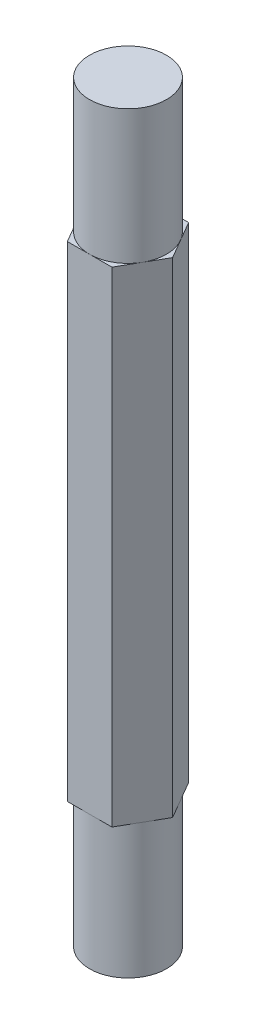
ISO-10303-21;
HEADER;
FILE_DESCRIPTION(('STEP AP214'),'2;1');
FILE_NAME('part.step','',(''),(''),'','','');
FILE_SCHEMA(('AUTOMOTIVE_DESIGN { 1 0 10303 214 1 1 1 1 }'));
ENDSEC;
DATA;
#1=APPLICATION_CONTEXT('core data for automotive mechanical design processes');
#2=APPLICATION_PROTOCOL_DEFINITION('international standard','automotive_design',2000,#1);
#3=PRODUCT_CONTEXT('',#1,'mechanical');
#4=PRODUCT('Part','Part','',(#3));
#5=PRODUCT_RELATED_PRODUCT_CATEGORY('part','',(#4));
#6=PRODUCT_DEFINITION_FORMATION('','',#4);
#7=PRODUCT_DEFINITION_CONTEXT('part definition',#1,'design');
#8=PRODUCT_DEFINITION('design','',#6,#7);
#9=PRODUCT_DEFINITION_SHAPE('','',#8);
#10=(LENGTH_UNIT() NAMED_UNIT(*) SI_UNIT(.MILLI.,.METRE.));
#11=(NAMED_UNIT(*) PLANE_ANGLE_UNIT() SI_UNIT($,.RADIAN.));
#12=(NAMED_UNIT(*) SI_UNIT($,.STERADIAN.) SOLID_ANGLE_UNIT());
#13=UNCERTAINTY_MEASURE_WITH_UNIT(LENGTH_MEASURE(1.E-05),#10,'distance_accuracy_value','');
#14=(GEOMETRIC_REPRESENTATION_CONTEXT(3) GLOBAL_UNCERTAINTY_ASSIGNED_CONTEXT((#13)) GLOBAL_UNIT_ASSIGNED_CONTEXT((#10,
#11,#12)) REPRESENTATION_CONTEXT('',''));
#15=CARTESIAN_POINT('',(0.,0.,0.));
#16=DIRECTION('',(0.,0.,1.));
#17=DIRECTION('',(1.,0.,0.));
#18=AXIS2_PLACEMENT_3D('',#15,#16,#17);
#19=CARTESIAN_POINT('',(0.,0.,0.));
#20=DIRECTION('',(0.,1.,0.));
#21=DIRECTION('',(0.,0.,1.));
#22=AXIS2_PLACEMENT_3D('',#19,#20,#21);
#23=PLANE('',#22);
#24=CARTESIAN_POINT('',(0.,0.,0.));
#25=DIRECTION('',(0.,-1.,0.));
#26=DIRECTION('',(0.,0.,-1.));
#27=AXIS2_PLACEMENT_3D('',#24,#25,#26);
#28=CIRCLE('',#27,3.175);
#29=CARTESIAN_POINT('',(2.74326666894791,0.,-1.59847207765397));
#30=VERTEX_POINT('',#29);
#31=CARTESIAN_POINT('',(2.75595076096238,0.,1.57650258583702));
#32=VERTEX_POINT('',#31);
#33=EDGE_CURVE('E52',#30,#32,#28,.T.);
#34=ORIENTED_EDGE('',*,*,#33,.F.);
#35=DIRECTION('',(-0.503455772489441,0.,-0.864020998093831));
#36=VECTOR('',#35,1.);
#37=CARTESIAN_POINT('',(3.66614495327353,0.,-0.0146463278779733));
#38=LINE('',#37,#36);
#39=CARTESIAN_POINT('',(3.66614495327353,0.,-0.0146463278779733));
#40=VERTEX_POINT('',#39);
#41=EDGE_CURVE('E136',#40,#30,#38,.T.);
#42=ORIENTED_EDGE('',*,*,#41,.F.);
#43=DIRECTION('',(0.496536247507724,0.,-0.868015987704689));
#44=VECTOR('',#43,1.);
#45=CARTESIAN_POINT('',(1.84575656865123,0.,3.16765149955201));
#46=LINE('',#45,#44);
#47=EDGE_CURVE('E153',#32,#40,#46,.T.);
#48=ORIENTED_EDGE('',*,*,#47,.F.);
#49=EDGE_LOOP('',(#34,#42,#48));
#50=FACE_BOUND('',#49,.T.);
#51=ADVANCED_FACE('F41',(#50),#23,.F.);
#52=CARTESIAN_POINT('',(0.0126840920144765,0.,3.174974663491));
#53=VERTEX_POINT('',#52);
#54=EDGE_CURVE('E11',#32,#53,#28,.T.);
#55=ORIENTED_EDGE('',*,*,#54,.F.);
#56=CARTESIAN_POINT('',(1.84575656865123,0.,3.16765149955201));
#57=VERTEX_POINT('',#56);
#58=EDGE_CURVE('E207',#57,#32,#46,.T.);
#59=ORIENTED_EDGE('',*,*,#58,.F.);
#60=DIRECTION('',(0.999992019997164,0.,-0.00399498961085876));
#61=VECTOR('',#60,1.);
#62=CARTESIAN_POINT('',(-1.82038838462228,0.,3.18229782742998));
#63=LINE('',#62,#61);
#64=EDGE_CURVE('E203',#53,#57,#63,.T.);
#65=ORIENTED_EDGE('',*,*,#64,.F.);
#66=EDGE_LOOP('',(#55,#59,#65));
#67=FACE_BOUND('',#66,.T.);
#68=ADVANCED_FACE('F246',(#67),#23,.F.);
#69=CARTESIAN_POINT('',(-2.7432666689479,0.,1.59847207765397));
#70=VERTEX_POINT('',#69);
#71=EDGE_CURVE('E50',#53,#70,#28,.T.);
#72=ORIENTED_EDGE('',*,*,#71,.F.);
#73=CARTESIAN_POINT('',(-1.82038838462228,0.,3.18229782742998));
#74=VERTEX_POINT('',#73);
#75=EDGE_CURVE('E204',#74,#53,#63,.T.);
#76=ORIENTED_EDGE('',*,*,#75,.F.);
#77=DIRECTION('',(0.503455772489441,0.,0.864020998093831));
#78=VECTOR('',#77,1.);
#79=CARTESIAN_POINT('',(-3.66614495327352,0.,0.0146463278779713));
#80=LINE('',#79,#78);
#81=EDGE_CURVE('E199',#70,#74,#80,.T.);
#82=ORIENTED_EDGE('',*,*,#81,.F.);
#83=EDGE_LOOP('',(#72,#76,#82));
#84=FACE_BOUND('',#83,.T.);
#85=ADVANCED_FACE('F251',(#84),#23,.F.);
#86=CARTESIAN_POINT('',(-2.75595076096238,0.,-1.57650258583701));
#87=VERTEX_POINT('',#86);
#88=EDGE_CURVE('E160',#70,#87,#28,.T.);
#89=ORIENTED_EDGE('',*,*,#88,.F.);
#90=CARTESIAN_POINT('',(-3.66614495327352,0.,0.0146463278779713));
#91=VERTEX_POINT('',#90);
#92=EDGE_CURVE('E200',#91,#70,#80,.T.);
#93=ORIENTED_EDGE('',*,*,#92,.F.);
#94=DIRECTION('',(-0.496536247507723,0.,0.86801598770469));
#95=VECTOR('',#94,1.);
#96=CARTESIAN_POINT('',(-1.84575656865123,0.,-3.16765149955201));
#97=LINE('',#96,#95);
#98=EDGE_CURVE('E195',#87,#91,#97,.T.);
#99=ORIENTED_EDGE('',*,*,#98,.F.);
#100=EDGE_LOOP('',(#89,#93,#99));
#101=FACE_BOUND('',#100,.T.);
#102=ADVANCED_FACE('F259',(#101),#23,.F.);
#103=CARTESIAN_POINT('',(-0.0126840920144826,0.,-3.174974663491));
#104=VERTEX_POINT('',#103);
#105=EDGE_CURVE('E66',#87,#104,#28,.T.);
#106=ORIENTED_EDGE('',*,*,#105,.F.);
#107=CARTESIAN_POINT('',(-1.84575656865123,0.,-3.16765149955201));
#108=VERTEX_POINT('',#107);
#109=EDGE_CURVE('E196',#108,#87,#97,.T.);
#110=ORIENTED_EDGE('',*,*,#109,.F.);
#111=DIRECTION('',(-0.999992019997164,0.,0.00399498961086065));
#112=VECTOR('',#111,1.);
#113=CARTESIAN_POINT('',(1.82038838462228,0.,-3.18229782742999));
#114=LINE('',#113,#112);
#115=EDGE_CURVE('E145',#104,#108,#114,.T.);
#116=ORIENTED_EDGE('',*,*,#115,.F.);
#117=EDGE_LOOP('',(#106,#110,#116));
#118=FACE_BOUND('',#117,.T.);
#119=ADVANCED_FACE('F261',(#118),#23,.F.);
#120=CARTESIAN_POINT('',(0.,40.005,0.));
#121=DIRECTION('',(0.,1.,0.));
#122=DIRECTION('',(0.,0.,1.));
#123=AXIS2_PLACEMENT_3D('',#120,#121,#122);
#124=PLANE('',#123);
#125=CARTESIAN_POINT('',(0.,40.005,0.));
#126=DIRECTION('',(0.,1.,0.));
#127=DIRECTION('',(0.,0.,1.));
#128=AXIS2_PLACEMENT_3D('',#125,#126,#127);
#129=CIRCLE('',#128,3.17499999999999);
#130=CARTESIAN_POINT('',(0.0126840920144765,40.005,3.17497466349099));
#131=VERTEX_POINT('',#130);
#132=CARTESIAN_POINT('',(2.75595076096238,40.005,1.57650258583702));
#133=VERTEX_POINT('',#132);
#134=EDGE_CURVE('E164',#131,#133,#129,.T.);
#135=ORIENTED_EDGE('',*,*,#134,.F.);
#136=DIRECTION('',(0.999992019997164,0.,-0.00399498961085876));
#137=VECTOR('',#136,1.);
#138=CARTESIAN_POINT('',(-1.82038838462228,40.005,3.18229782742998));
#139=LINE('',#138,#137);
#140=CARTESIAN_POINT('',(1.84575656865123,40.005,3.16765149955201));
#141=VERTEX_POINT('',#140);
#142=EDGE_CURVE('E187',#131,#141,#139,.T.);
#143=ORIENTED_EDGE('',*,*,#142,.T.);
#144=DIRECTION('',(0.496536247507724,0.,-0.868015987704689));
#145=VECTOR('',#144,1.);
#146=CARTESIAN_POINT('',(1.84575656865123,40.005,3.16765149955201));
#147=LINE('',#146,#145);
#148=EDGE_CURVE('E191',#141,#133,#147,.T.);
#149=ORIENTED_EDGE('',*,*,#148,.T.);
#150=EDGE_LOOP('',(#135,#143,#149));
#151=FACE_BOUND('',#150,.T.);
#152=ADVANCED_FACE('F290',(#151),#124,.T.);
#153=CARTESIAN_POINT('',(2.74326666894791,40.005,-1.59847207765397));
#154=VERTEX_POINT('',#153);
#155=EDGE_CURVE('E159',#133,#154,#129,.T.);
#156=ORIENTED_EDGE('',*,*,#155,.F.);
#157=CARTESIAN_POINT('',(3.66614495327353,40.005,-0.0146463278779733));
#158=VERTEX_POINT('',#157);
#159=EDGE_CURVE('E190',#133,#158,#147,.T.);
#160=ORIENTED_EDGE('',*,*,#159,.T.);
#161=DIRECTION('',(-0.503455772489441,0.,-0.864020998093831));
#162=VECTOR('',#161,1.);
#163=CARTESIAN_POINT('',(3.66614495327353,40.005,-0.0146463278779733));
#164=LINE('',#163,#162);
#165=EDGE_CURVE('E171',#158,#154,#164,.T.);
#166=ORIENTED_EDGE('',*,*,#165,.T.);
#167=EDGE_LOOP('',(#156,#160,#166));
#168=FACE_BOUND('',#167,.T.);
#169=ADVANCED_FACE('F237',(#168),#124,.T.);
#170=CARTESIAN_POINT('',(-0.0126840920144826,40.005,-3.174974663491));
#171=VERTEX_POINT('',#170);
#172=EDGE_CURVE('E162',#154,#171,#129,.T.);
#173=ORIENTED_EDGE('',*,*,#172,.F.);
#174=CARTESIAN_POINT('',(1.82038838462228,40.005,-3.18229782742999));
#175=VERTEX_POINT('',#174);
#176=EDGE_CURVE('E175',#154,#175,#164,.T.);
#177=ORIENTED_EDGE('',*,*,#176,.T.);
#178=DIRECTION('',(-0.999992019997164,0.,0.00399498961086065));
#179=VECTOR('',#178,1.);
#180=CARTESIAN_POINT('',(1.82038838462228,40.005,-3.18229782742999));
#181=LINE('',#180,#179);
#182=EDGE_CURVE('E176',#175,#171,#181,.T.);
#183=ORIENTED_EDGE('',*,*,#182,.T.);
#184=EDGE_LOOP('',(#173,#177,#183));
#185=FACE_BOUND('',#184,.T.);
#186=ADVANCED_FACE('F235',(#185),#124,.T.);
#187=CARTESIAN_POINT('',(-2.75595076096238,40.005,-1.57650258583701));
#188=VERTEX_POINT('',#187);
#189=EDGE_CURVE('E229',#171,#188,#129,.T.);
#190=ORIENTED_EDGE('',*,*,#189,.F.);
#191=CARTESIAN_POINT('',(-1.84575656865123,40.005,-3.16765149955201));
#192=VERTEX_POINT('',#191);
#193=EDGE_CURVE('E174',#171,#192,#181,.T.);
#194=ORIENTED_EDGE('',*,*,#193,.T.);
#195=DIRECTION('',(-0.496536247507723,0.,0.86801598770469));
#196=VECTOR('',#195,1.);
#197=CARTESIAN_POINT('',(-1.84575656865123,40.005,-3.16765149955201));
#198=LINE('',#197,#196);
#199=EDGE_CURVE('E180',#192,#188,#198,.T.);
#200=ORIENTED_EDGE('',*,*,#199,.T.);
#201=EDGE_LOOP('',(#190,#194,#200));
#202=FACE_BOUND('',#201,.T.);
#203=ADVANCED_FACE('F361',(#202),#124,.T.);
#204=CARTESIAN_POINT('',(-2.7432666689479,40.005,1.59847207765397));
#205=VERTEX_POINT('',#204);
#206=EDGE_CURVE('E226',#188,#205,#129,.T.);
#207=ORIENTED_EDGE('',*,*,#206,.F.);
#208=CARTESIAN_POINT('',(-3.66614495327352,40.005,0.0146463278779713));
#209=VERTEX_POINT('',#208);
#210=EDGE_CURVE('E179',#188,#209,#198,.T.);
#211=ORIENTED_EDGE('',*,*,#210,.T.);
#212=DIRECTION('',(0.503455772489441,0.,0.864020998093831));
#213=VECTOR('',#212,1.);
#214=CARTESIAN_POINT('',(-3.66614495327352,40.005,0.0146463278779713));
#215=LINE('',#214,#213);
#216=EDGE_CURVE('E184',#209,#205,#215,.T.);
#217=ORIENTED_EDGE('',*,*,#216,.T.);
#218=EDGE_LOOP('',(#207,#211,#217));
#219=FACE_BOUND('',#218,.T.);
#220=ADVANCED_FACE('F269',(#219),#124,.T.);
#221=CARTESIAN_POINT('',(3.66614495327353,40.005,-0.0146463278779733));
#222=DIRECTION('',(-0.864020998093831,0.,0.503455772489441));
#223=DIRECTION('',(0.503455772489441,0.,0.864020998093831));
#224=AXIS2_PLACEMENT_3D('',#221,#222,#223);
#225=PLANE('',#224);
#226=ORIENTED_EDGE('',*,*,#41,.T.);
#227=CARTESIAN_POINT('',(1.82038838462228,0.,-3.18229782742999));
#228=VERTEX_POINT('',#227);
#229=EDGE_CURVE('E138',#30,#228,#38,.T.);
#230=ORIENTED_EDGE('',*,*,#229,.T.);
#231=DIRECTION('',(0.,-1.,0.));
#232=VECTOR('',#231,1.);
#233=CARTESIAN_POINT('',(1.82038838462228,40.005,-3.18229782742999));
#234=LINE('',#233,#232);
#235=EDGE_CURVE('E45',#175,#228,#234,.T.);
#236=ORIENTED_EDGE('',*,*,#235,.F.);
#237=ORIENTED_EDGE('',*,*,#176,.F.);
#238=ORIENTED_EDGE('',*,*,#165,.F.);
#239=DIRECTION('',(0.,-1.,0.));
#240=VECTOR('',#239,1.);
#241=CARTESIAN_POINT('',(3.66614495327353,40.005,-0.0146463278779733));
#242=LINE('',#241,#240);
#243=EDGE_CURVE('E141',#158,#40,#242,.T.);
#244=ORIENTED_EDGE('',*,*,#243,.T.);
#245=EDGE_LOOP('',(#226,#230,#236,#237,#238,#244));
#246=FACE_BOUND('',#245,.T.);
#247=ADVANCED_FACE('F43',(#246),#225,.F.);
#248=CARTESIAN_POINT('',(1.82038838462228,40.005,-3.18229782742999));
#249=DIRECTION('',(0.00399498961086065,0.,0.999992019997164));
#250=DIRECTION('',(0.999992019997164,0.,-0.00399498961086065));
#251=AXIS2_PLACEMENT_3D('',#248,#249,#250);
#252=PLANE('',#251);
#253=EDGE_CURVE('E149',#228,#104,#114,.T.);
#254=ORIENTED_EDGE('',*,*,#253,.T.);
#255=ORIENTED_EDGE('',*,*,#115,.T.);
#256=DIRECTION('',(0.,-1.,0.));
#257=VECTOR('',#256,1.);
#258=CARTESIAN_POINT('',(-1.84575656865123,40.005,-3.16765149955201));
#259=LINE('',#258,#257);
#260=EDGE_CURVE('E218',#192,#108,#259,.T.);
#261=ORIENTED_EDGE('',*,*,#260,.F.);
#262=ORIENTED_EDGE('',*,*,#193,.F.);
#263=ORIENTED_EDGE('',*,*,#182,.F.);
#264=ORIENTED_EDGE('',*,*,#235,.T.);
#265=EDGE_LOOP('',(#254,#255,#261,#262,#263,#264));
#266=FACE_BOUND('',#265,.T.);
#267=ADVANCED_FACE('F262',(#266),#252,.F.);
#268=CARTESIAN_POINT('',(-1.84575656865123,40.005,-3.16765149955201));
#269=DIRECTION('',(0.86801598770469,0.,0.496536247507723));
#270=DIRECTION('',(0.496536247507723,0.,-0.868015987704691));
#271=AXIS2_PLACEMENT_3D('',#268,#269,#270);
#272=PLANE('',#271);
#273=ORIENTED_EDGE('',*,*,#109,.T.);
#274=ORIENTED_EDGE('',*,*,#98,.T.);
#275=DIRECTION('',(0.,-1.,0.));
#276=VECTOR('',#275,1.);
#277=CARTESIAN_POINT('',(-3.66614495327352,40.005,0.0146463278779713));
#278=LINE('',#277,#276);
#279=EDGE_CURVE('E216',#209,#91,#278,.T.);
#280=ORIENTED_EDGE('',*,*,#279,.F.);
#281=ORIENTED_EDGE('',*,*,#210,.F.);
#282=ORIENTED_EDGE('',*,*,#199,.F.);
#283=ORIENTED_EDGE('',*,*,#260,.T.);
#284=EDGE_LOOP('',(#273,#274,#280,#281,#282,#283));
#285=FACE_BOUND('',#284,.T.);
#286=ADVANCED_FACE('F260',(#285),#272,.F.);
#287=CARTESIAN_POINT('',(-3.66614495327352,40.005,0.0146463278779713));
#288=DIRECTION('',(0.864020998093831,0.,-0.503455772489441));
#289=DIRECTION('',(-0.503455772489441,0.,-0.864020998093831));
#290=AXIS2_PLACEMENT_3D('',#287,#288,#289);
#291=PLANE('',#290);
#292=ORIENTED_EDGE('',*,*,#92,.T.);
#293=ORIENTED_EDGE('',*,*,#81,.T.);
#294=DIRECTION('',(0.,-1.,0.));
#295=VECTOR('',#294,1.);
#296=CARTESIAN_POINT('',(-1.82038838462228,40.005,3.18229782742998));
#297=LINE('',#296,#295);
#298=CARTESIAN_POINT('',(-1.82038838462228,40.005,3.18229782742998));
#299=VERTEX_POINT('',#298);
#300=EDGE_CURVE('E213',#299,#74,#297,.T.);
#301=ORIENTED_EDGE('',*,*,#300,.F.);
#302=EDGE_CURVE('E183',#205,#299,#215,.T.);
#303=ORIENTED_EDGE('',*,*,#302,.F.);
#304=ORIENTED_EDGE('',*,*,#216,.F.);
#305=ORIENTED_EDGE('',*,*,#279,.T.);
#306=EDGE_LOOP('',(#292,#293,#301,#303,#304,#305));
#307=FACE_BOUND('',#306,.T.);
#308=ADVANCED_FACE('F255',(#307),#291,.F.);
#309=CARTESIAN_POINT('',(-1.82038838462228,40.005,3.18229782742998));
#310=DIRECTION('',(-0.00399498961085876,0.,-0.999992019997164));
#311=DIRECTION('',(-0.999992019997164,0.,0.00399498961085876));
#312=AXIS2_PLACEMENT_3D('',#309,#310,#311);
#313=PLANE('',#312);
#314=ORIENTED_EDGE('',*,*,#75,.T.);
#315=ORIENTED_EDGE('',*,*,#64,.T.);
#316=DIRECTION('',(0.,-1.,0.));
#317=VECTOR('',#316,1.);
#318=CARTESIAN_POINT('',(1.84575656865123,40.005,3.16765149955201));
#319=LINE('',#318,#317);
#320=EDGE_CURVE('E210',#141,#57,#319,.T.);
#321=ORIENTED_EDGE('',*,*,#320,.F.);
#322=ORIENTED_EDGE('',*,*,#142,.F.);
#323=EDGE_CURVE('E188',#299,#131,#139,.T.);
#324=ORIENTED_EDGE('',*,*,#323,.F.);
#325=ORIENTED_EDGE('',*,*,#300,.T.);
#326=EDGE_LOOP('',(#314,#315,#321,#322,#324,#325));
#327=FACE_BOUND('',#326,.T.);
#328=ADVANCED_FACE('F409',(#327),#313,.F.);
#329=CARTESIAN_POINT('',(1.84575656865123,40.005,3.16765149955201));
#330=DIRECTION('',(-0.86801598770469,0.,-0.496536247507724));
#331=DIRECTION('',(-0.496536247507724,0.,0.86801598770469));
#332=AXIS2_PLACEMENT_3D('',#329,#330,#331);
#333=PLANE('',#332);
#334=ORIENTED_EDGE('',*,*,#58,.T.);
#335=ORIENTED_EDGE('',*,*,#47,.T.);
#336=ORIENTED_EDGE('',*,*,#243,.F.);
#337=ORIENTED_EDGE('',*,*,#159,.F.);
#338=ORIENTED_EDGE('',*,*,#148,.F.);
#339=ORIENTED_EDGE('',*,*,#320,.T.);
#340=EDGE_LOOP('',(#334,#335,#336,#337,#338,#339));
#341=FACE_BOUND('',#340,.T.);
#342=ADVANCED_FACE('F241',(#341),#333,.F.);
#343=EDGE_CURVE('E170',#205,#131,#129,.T.);
#344=ORIENTED_EDGE('',*,*,#343,.F.);
#345=ORIENTED_EDGE('',*,*,#302,.T.);
#346=ORIENTED_EDGE('',*,*,#323,.T.);
#347=EDGE_LOOP('',(#344,#345,#346));
#348=FACE_BOUND('',#347,.T.);
#349=ADVANCED_FACE('F279',(#348),#124,.T.);
#350=EDGE_CURVE('E59',#104,#30,#28,.T.);
#351=ORIENTED_EDGE('',*,*,#350,.F.);
#352=ORIENTED_EDGE('',*,*,#253,.F.);
#353=ORIENTED_EDGE('',*,*,#229,.F.);
#354=EDGE_LOOP('',(#351,#352,#353));
#355=FACE_BOUND('',#354,.T.);
#356=ADVANCED_FACE('F147',(#355),#23,.F.);
#357=CARTESIAN_POINT('',(0.,51.054,0.));
#358=DIRECTION('',(0.,-1.,0.));
#359=DIRECTION('',(0.,0.,-1.));
#360=AXIS2_PLACEMENT_3D('',#357,#358,#359);
#361=CYLINDRICAL_SURFACE('',#360,3.17499999999999);
#362=CARTESIAN_POINT('',(0.,51.054,0.));
#363=DIRECTION('',(0.,1.,0.));
#364=DIRECTION('',(0.,0.,1.));
#365=AXIS2_PLACEMENT_3D('',#362,#363,#364);
#366=CIRCLE('',#365,3.17499999999999);
#367=CARTESIAN_POINT('',(0.,51.054,3.17499999999999));
#368=VERTEX_POINT('',#367);
#369=EDGE_CURVE('E151',#368,#368,#366,.T.);
#370=ORIENTED_EDGE('',*,*,#369,.F.);
#371=EDGE_LOOP('',(#370));
#372=FACE_BOUND('',#371,.T.);
#373=ORIENTED_EDGE('',*,*,#134,.T.);
#374=ORIENTED_EDGE('',*,*,#155,.T.);
#375=ORIENTED_EDGE('',*,*,#172,.T.);
#376=ORIENTED_EDGE('',*,*,#189,.T.);
#377=ORIENTED_EDGE('',*,*,#206,.T.);
#378=ORIENTED_EDGE('',*,*,#343,.T.);
#379=EDGE_LOOP('',(#373,#374,#375,#376,#377,#378));
#380=FACE_BOUND('',#379,.T.);
#381=ADVANCED_FACE('F232',(#372,#380),#361,.T.);
#382=CARTESIAN_POINT('',(0.,51.054,0.));
#383=DIRECTION('',(0.,1.,0.));
#384=DIRECTION('',(0.,0.,1.));
#385=AXIS2_PLACEMENT_3D('',#382,#383,#384);
#386=PLANE('',#385);
#387=ORIENTED_EDGE('',*,*,#369,.T.);
#388=EDGE_LOOP('',(#387));
#389=FACE_BOUND('',#388,.T.);
#390=ADVANCED_FACE('F285',(#389),#386,.T.);
#391=CARTESIAN_POINT('',(0.,-11.049,0.));
#392=DIRECTION('',(0.,1.,0.));
#393=DIRECTION('',(0.,0.,1.));
#394=AXIS2_PLACEMENT_3D('',#391,#392,#393);
#395=CYLINDRICAL_SURFACE('',#394,3.175);
#396=CARTESIAN_POINT('',(0.,-11.049,0.));
#397=DIRECTION('',(0.,-1.,0.));
#398=DIRECTION('',(0.,0.,-1.));
#399=AXIS2_PLACEMENT_3D('',#396,#397,#398);
#400=CIRCLE('',#399,3.175);
#401=CARTESIAN_POINT('',(0.,-11.049,-3.175));
#402=VERTEX_POINT('',#401);
#403=EDGE_CURVE('E156',#402,#402,#400,.T.);
#404=ORIENTED_EDGE('',*,*,#403,.F.);
#405=EDGE_LOOP('',(#404));
#406=FACE_BOUND('',#405,.T.);
#407=ORIENTED_EDGE('',*,*,#33,.T.);
#408=ORIENTED_EDGE('',*,*,#54,.T.);
#409=ORIENTED_EDGE('',*,*,#71,.T.);
#410=ORIENTED_EDGE('',*,*,#88,.T.);
#411=ORIENTED_EDGE('',*,*,#105,.T.);
#412=ORIENTED_EDGE('',*,*,#350,.T.);
#413=EDGE_LOOP('',(#407,#408,#409,#410,#411,#412));
#414=FACE_BOUND('',#413,.T.);
#415=ADVANCED_FACE('F157',(#406,#414),#395,.T.);
#416=CARTESIAN_POINT('',(0.,-11.049,0.));
#417=DIRECTION('',(0.,-1.,0.));
#418=DIRECTION('',(0.,0.,-1.));
#419=AXIS2_PLACEMENT_3D('',#416,#417,#418);
#420=PLANE('',#419);
#421=ORIENTED_EDGE('',*,*,#403,.T.);
#422=EDGE_LOOP('',(#421));
#423=FACE_BOUND('',#422,.T.);
#424=ADVANCED_FACE('F322',(#423),#420,.T.);
#425=CLOSED_SHELL('',(#51,#68,#85,#102,#119,#152,#169,#186,#203,#220,#247,#267,#286,#308,#328,
#342,#349,#356,#381,#390,#415,#424));
#426=MANIFOLD_SOLID_BREP('B2',#425);
#427=ADVANCED_BREP_SHAPE_REPRESENTATION('',(#18,#426),#14);
#428=SHAPE_DEFINITION_REPRESENTATION(#9,#427);
ENDSEC;
END-ISO-10303-21;
